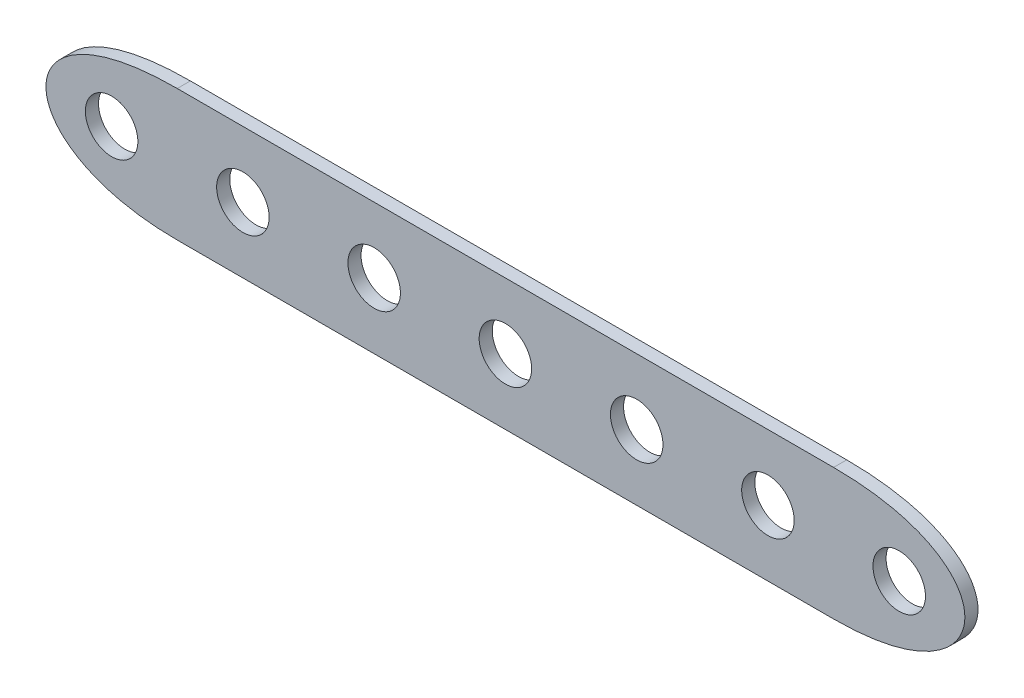
ISO-10303-21;
HEADER;
FILE_DESCRIPTION(('STEP AP214'),'2;1');
FILE_NAME('part.step','',(''),(''),'','','');
FILE_SCHEMA(('AUTOMOTIVE_DESIGN { 1 0 10303 214 1 1 1 1 }'));
ENDSEC;
DATA;
#1=APPLICATION_CONTEXT('core data for automotive mechanical design processes');
#2=APPLICATION_PROTOCOL_DEFINITION('international standard','automotive_design',2000,#1);
#3=PRODUCT_CONTEXT('',#1,'mechanical');
#4=PRODUCT('Part','Part','',(#3));
#5=PRODUCT_RELATED_PRODUCT_CATEGORY('part','',(#4));
#6=PRODUCT_DEFINITION_FORMATION('','',#4);
#7=PRODUCT_DEFINITION_CONTEXT('part definition',#1,'design');
#8=PRODUCT_DEFINITION('design','',#6,#7);
#9=PRODUCT_DEFINITION_SHAPE('','',#8);
#10=(LENGTH_UNIT() NAMED_UNIT(*) SI_UNIT(.MILLI.,.METRE.));
#11=(NAMED_UNIT(*) PLANE_ANGLE_UNIT() SI_UNIT($,.RADIAN.));
#12=(NAMED_UNIT(*) SI_UNIT($,.STERADIAN.) SOLID_ANGLE_UNIT());
#13=UNCERTAINTY_MEASURE_WITH_UNIT(LENGTH_MEASURE(1.E-05),#10,'distance_accuracy_value','');
#14=(GEOMETRIC_REPRESENTATION_CONTEXT(3) GLOBAL_UNCERTAINTY_ASSIGNED_CONTEXT((#13)) GLOBAL_UNIT_ASSIGNED_CONTEXT((#10,
#11,#12)) REPRESENTATION_CONTEXT('',''));
#15=CARTESIAN_POINT('',(0.,0.,0.));
#16=DIRECTION('',(0.,0.,1.));
#17=DIRECTION('',(1.,0.,0.));
#18=AXIS2_PLACEMENT_3D('',#15,#16,#17);
#19=CARTESIAN_POINT('',(0.,-5.,1.));
#20=DIRECTION('',(0.,0.,-1.));
#21=DIRECTION('',(-1.,0.,0.));
#22=AXIS2_PLACEMENT_3D('',#19,#20,#21);
#23=PLANE('',#22);
#24=CARTESIAN_POINT('',(10.,0.,1.));
#25=CARTESIAN_POINT('',(-3.74368541872553,0.,1.));
#26=CARTESIAN_POINT('',(-2.92298124794113,-10.0000000000001,1.));
#27=CARTESIAN_POINT('',(10.,-10.,1.));
#28=B_SPLINE_CURVE_WITH_KNOTS('',3,(#24,#25,#26,#27),.UNSPECIFIED.,.F.,.F.,(4,4),(0.,1.),.UNSPECIFIED.);
#29=CARTESIAN_POINT('',(10.,0.,1.));
#30=VERTEX_POINT('',#29);
#31=CARTESIAN_POINT('',(10.,-10.,1.));
#32=VERTEX_POINT('',#31);
#33=EDGE_CURVE('E88',#30,#32,#28,.T.);
#34=ORIENTED_EDGE('',*,*,#33,.T.);
#35=DIRECTION('',(1.,0.,0.));
#36=VECTOR('',#35,1.);
#37=CARTESIAN_POINT('',(60.,-10.,1.));
#38=LINE('',#37,#36);
#39=CARTESIAN_POINT('',(60.,-10.,1.));
#40=VERTEX_POINT('',#39);
#41=EDGE_CURVE('E83',#32,#40,#38,.T.);
#42=ORIENTED_EDGE('',*,*,#41,.T.);
#43=CARTESIAN_POINT('',(60.,-10.,1.));
#44=CARTESIAN_POINT('',(72.9229812479412,-10.,1.));
#45=CARTESIAN_POINT('',(73.7436854187255,0.,1.));
#46=CARTESIAN_POINT('',(60.,0.,1.));
#47=B_SPLINE_CURVE_WITH_KNOTS('',3,(#43,#44,#45,#46),.UNSPECIFIED.,.F.,.F.,(4,4),(0.,1.),.UNSPECIFIED.);
#48=CARTESIAN_POINT('',(60.,0.,1.));
#49=VERTEX_POINT('',#48);
#50=EDGE_CURVE('E86',#40,#49,#47,.T.);
#51=ORIENTED_EDGE('',*,*,#50,.T.);
#52=DIRECTION('',(-1.,0.,0.));
#53=VECTOR('',#52,1.);
#54=CARTESIAN_POINT('',(10.,0.,1.));
#55=LINE('',#54,#53);
#56=EDGE_CURVE('E53',#49,#30,#55,.T.);
#57=ORIENTED_EDGE('',*,*,#56,.T.);
#58=EDGE_LOOP('',(#34,#42,#51,#57));
#59=FACE_BOUND('',#58,.T.);
#60=CARTESIAN_POINT('',(5.,-5.,1.));
#61=DIRECTION('',(0.,0.,1.));
#62=DIRECTION('',(1.,0.,0.));
#63=AXIS2_PLACEMENT_3D('',#60,#61,#62);
#64=CIRCLE('',#63,2.);
#65=CARTESIAN_POINT('',(7.,-5.,1.));
#66=VERTEX_POINT('',#65);
#67=EDGE_CURVE('E194',#66,#66,#64,.T.);
#68=ORIENTED_EDGE('',*,*,#67,.F.);
#69=EDGE_LOOP('',(#68));
#70=FACE_BOUND('',#69,.T.);
#71=CARTESIAN_POINT('',(65.,-5.,1.));
#72=DIRECTION('',(0.,0.,1.));
#73=DIRECTION('',(1.,0.,0.));
#74=AXIS2_PLACEMENT_3D('',#71,#72,#73);
#75=CIRCLE('',#74,2.);
#76=CARTESIAN_POINT('',(67.,-5.,1.));
#77=VERTEX_POINT('',#76);
#78=EDGE_CURVE('E188',#77,#77,#75,.T.);
#79=ORIENTED_EDGE('',*,*,#78,.F.);
#80=EDGE_LOOP('',(#79));
#81=FACE_BOUND('',#80,.T.);
#82=CARTESIAN_POINT('',(15.,-5.,1.));
#83=DIRECTION('',(0.,0.,1.));
#84=DIRECTION('',(1.,0.,0.));
#85=AXIS2_PLACEMENT_3D('',#82,#83,#84);
#86=CIRCLE('',#85,2.);
#87=CARTESIAN_POINT('',(17.,-5.,1.));
#88=VERTEX_POINT('',#87);
#89=EDGE_CURVE('E182',#88,#88,#86,.T.);
#90=ORIENTED_EDGE('',*,*,#89,.F.);
#91=EDGE_LOOP('',(#90));
#92=FACE_BOUND('',#91,.T.);
#93=CARTESIAN_POINT('',(25.,-5.,1.));
#94=DIRECTION('',(0.,0.,1.));
#95=DIRECTION('',(1.,0.,0.));
#96=AXIS2_PLACEMENT_3D('',#93,#94,#95);
#97=CIRCLE('',#96,2.);
#98=CARTESIAN_POINT('',(27.,-5.,1.));
#99=VERTEX_POINT('',#98);
#100=EDGE_CURVE('E176',#99,#99,#97,.T.);
#101=ORIENTED_EDGE('',*,*,#100,.F.);
#102=EDGE_LOOP('',(#101));
#103=FACE_BOUND('',#102,.T.);
#104=CARTESIAN_POINT('',(35.,-5.,1.));
#105=DIRECTION('',(0.,0.,1.));
#106=DIRECTION('',(1.,0.,0.));
#107=AXIS2_PLACEMENT_3D('',#104,#105,#106);
#108=CIRCLE('',#107,2.);
#109=CARTESIAN_POINT('',(37.,-5.,1.));
#110=VERTEX_POINT('',#109);
#111=EDGE_CURVE('E170',#110,#110,#108,.T.);
#112=ORIENTED_EDGE('',*,*,#111,.F.);
#113=EDGE_LOOP('',(#112));
#114=FACE_BOUND('',#113,.T.);
#115=CARTESIAN_POINT('',(45.,-5.,1.));
#116=DIRECTION('',(0.,0.,1.));
#117=DIRECTION('',(1.,0.,0.));
#118=AXIS2_PLACEMENT_3D('',#115,#116,#117);
#119=CIRCLE('',#118,2.);
#120=CARTESIAN_POINT('',(47.,-5.,1.));
#121=VERTEX_POINT('',#120);
#122=EDGE_CURVE('E164',#121,#121,#119,.T.);
#123=ORIENTED_EDGE('',*,*,#122,.F.);
#124=EDGE_LOOP('',(#123));
#125=FACE_BOUND('',#124,.T.);
#126=CARTESIAN_POINT('',(55.,-5.,1.));
#127=DIRECTION('',(0.,0.,1.));
#128=DIRECTION('',(1.,0.,0.));
#129=AXIS2_PLACEMENT_3D('',#126,#127,#128);
#130=CIRCLE('',#129,2.);
#131=CARTESIAN_POINT('',(57.,-5.,1.));
#132=VERTEX_POINT('',#131);
#133=EDGE_CURVE('E155',#132,#132,#130,.T.);
#134=ORIENTED_EDGE('',*,*,#133,.F.);
#135=EDGE_LOOP('',(#134));
#136=FACE_BOUND('',#135,.T.);
#137=ADVANCED_FACE('F35',(#59,#70,#81,#92,#103,#114,#125,#136),#23,.F.);
#138=CARTESIAN_POINT('',(0.,-5.,0.));
#139=DIRECTION('',(0.,0.,-1.));
#140=DIRECTION('',(-1.,0.,0.));
#141=AXIS2_PLACEMENT_3D('',#138,#139,#140);
#142=PLANE('',#141);
#143=CARTESIAN_POINT('',(45.,-5.,0.));
#144=DIRECTION('',(0.,0.,1.));
#145=DIRECTION('',(1.,0.,0.));
#146=AXIS2_PLACEMENT_3D('',#143,#144,#145);
#147=CIRCLE('',#146,2.);
#148=CARTESIAN_POINT('',(47.,-5.,0.));
#149=VERTEX_POINT('',#148);
#150=EDGE_CURVE('E161',#149,#149,#147,.T.);
#151=ORIENTED_EDGE('',*,*,#150,.T.);
#152=EDGE_LOOP('',(#151));
#153=FACE_BOUND('',#152,.T.);
#154=CARTESIAN_POINT('',(25.,-5.,0.));
#155=DIRECTION('',(0.,0.,1.));
#156=DIRECTION('',(1.,0.,0.));
#157=AXIS2_PLACEMENT_3D('',#154,#155,#156);
#158=CIRCLE('',#157,2.);
#159=CARTESIAN_POINT('',(27.,-5.,0.));
#160=VERTEX_POINT('',#159);
#161=EDGE_CURVE('E173',#160,#160,#158,.T.);
#162=ORIENTED_EDGE('',*,*,#161,.T.);
#163=EDGE_LOOP('',(#162));
#164=FACE_BOUND('',#163,.T.);
#165=CARTESIAN_POINT('',(65.,-5.,0.));
#166=DIRECTION('',(0.,0.,1.));
#167=DIRECTION('',(1.,0.,0.));
#168=AXIS2_PLACEMENT_3D('',#165,#166,#167);
#169=CIRCLE('',#168,2.);
#170=CARTESIAN_POINT('',(67.,-5.,0.));
#171=VERTEX_POINT('',#170);
#172=EDGE_CURVE('E185',#171,#171,#169,.T.);
#173=ORIENTED_EDGE('',*,*,#172,.T.);
#174=EDGE_LOOP('',(#173));
#175=FACE_BOUND('',#174,.T.);
#176=CARTESIAN_POINT('',(10.,0.,0.));
#177=CARTESIAN_POINT('',(-3.74368541872553,0.,0.));
#178=CARTESIAN_POINT('',(-2.92298124794113,-10.0000000000001,0.));
#179=CARTESIAN_POINT('',(10.,-10.,0.));
#180=B_SPLINE_CURVE_WITH_KNOTS('',3,(#176,#177,#178,#179),.UNSPECIFIED.,.F.,.F.,(4,4),(0.,1.),.UNSPECIFIED.);
#181=CARTESIAN_POINT('',(10.,0.,0.));
#182=VERTEX_POINT('',#181);
#183=CARTESIAN_POINT('',(10.,-10.,0.));
#184=VERTEX_POINT('',#183);
#185=EDGE_CURVE('E197',#182,#184,#180,.T.);
#186=ORIENTED_EDGE('',*,*,#185,.F.);
#187=DIRECTION('',(-1.,0.,0.));
#188=VECTOR('',#187,1.);
#189=CARTESIAN_POINT('',(10.,0.,0.));
#190=LINE('',#189,#188);
#191=CARTESIAN_POINT('',(60.,0.,0.));
#192=VERTEX_POINT('',#191);
#193=EDGE_CURVE('E76',#192,#182,#190,.T.);
#194=ORIENTED_EDGE('',*,*,#193,.F.);
#195=CARTESIAN_POINT('',(60.,-10.,0.));
#196=CARTESIAN_POINT('',(72.9229812479412,-10.,0.));
#197=CARTESIAN_POINT('',(73.7436854187255,0.,0.));
#198=CARTESIAN_POINT('',(60.,0.,0.));
#199=B_SPLINE_CURVE_WITH_KNOTS('',3,(#195,#196,#197,#198),.UNSPECIFIED.,.F.,.F.,(4,4),(0.,1.),.UNSPECIFIED.);
#200=CARTESIAN_POINT('',(60.,-10.,0.));
#201=VERTEX_POINT('',#200);
#202=EDGE_CURVE('E70',#201,#192,#199,.T.);
#203=ORIENTED_EDGE('',*,*,#202,.F.);
#204=DIRECTION('',(1.,0.,0.));
#205=VECTOR('',#204,1.);
#206=CARTESIAN_POINT('',(60.,-10.,0.));
#207=LINE('',#206,#205);
#208=EDGE_CURVE('E92',#184,#201,#207,.T.);
#209=ORIENTED_EDGE('',*,*,#208,.F.);
#210=EDGE_LOOP('',(#186,#194,#203,#209));
#211=FACE_BOUND('',#210,.T.);
#212=CARTESIAN_POINT('',(5.,-5.,0.));
#213=DIRECTION('',(0.,0.,1.));
#214=DIRECTION('',(1.,0.,0.));
#215=AXIS2_PLACEMENT_3D('',#212,#213,#214);
#216=CIRCLE('',#215,2.);
#217=CARTESIAN_POINT('',(7.,-5.,0.));
#218=VERTEX_POINT('',#217);
#219=EDGE_CURVE('E191',#218,#218,#216,.T.);
#220=ORIENTED_EDGE('',*,*,#219,.T.);
#221=EDGE_LOOP('',(#220));
#222=FACE_BOUND('',#221,.T.);
#223=CARTESIAN_POINT('',(15.,-5.,0.));
#224=DIRECTION('',(0.,0.,1.));
#225=DIRECTION('',(1.,0.,0.));
#226=AXIS2_PLACEMENT_3D('',#223,#224,#225);
#227=CIRCLE('',#226,2.);
#228=CARTESIAN_POINT('',(17.,-5.,0.));
#229=VERTEX_POINT('',#228);
#230=EDGE_CURVE('E179',#229,#229,#227,.T.);
#231=ORIENTED_EDGE('',*,*,#230,.T.);
#232=EDGE_LOOP('',(#231));
#233=FACE_BOUND('',#232,.T.);
#234=CARTESIAN_POINT('',(35.,-5.,0.));
#235=DIRECTION('',(0.,0.,1.));
#236=DIRECTION('',(1.,0.,0.));
#237=AXIS2_PLACEMENT_3D('',#234,#235,#236);
#238=CIRCLE('',#237,2.);
#239=CARTESIAN_POINT('',(37.,-5.,0.));
#240=VERTEX_POINT('',#239);
#241=EDGE_CURVE('E167',#240,#240,#238,.T.);
#242=ORIENTED_EDGE('',*,*,#241,.T.);
#243=EDGE_LOOP('',(#242));
#244=FACE_BOUND('',#243,.T.);
#245=CARTESIAN_POINT('',(55.,-5.,0.));
#246=DIRECTION('',(0.,0.,1.));
#247=DIRECTION('',(1.,0.,0.));
#248=AXIS2_PLACEMENT_3D('',#245,#246,#247);
#249=CIRCLE('',#248,2.);
#250=CARTESIAN_POINT('',(57.,-5.,0.));
#251=VERTEX_POINT('',#250);
#252=EDGE_CURVE('E158',#251,#251,#249,.T.);
#253=ORIENTED_EDGE('',*,*,#252,.T.);
#254=EDGE_LOOP('',(#253));
#255=FACE_BOUND('',#254,.T.);
#256=ADVANCED_FACE('F114',(#153,#164,#175,#211,#222,#233,#244,#255),#142,.T.);
#257=DIRECTION('',(0.,0.,-1.));
#258=VECTOR('',#257,1.);
#259=SURFACE_OF_LINEAR_EXTRUSION('',#28,#258);
#260=ORIENTED_EDGE('',*,*,#185,.T.);
#261=DIRECTION('',(0.,0.,-1.));
#262=VECTOR('',#261,1.);
#263=CARTESIAN_POINT('',(10.,-10.,1.));
#264=LINE('',#263,#262);
#265=EDGE_CURVE('E11',#32,#184,#264,.T.);
#266=ORIENTED_EDGE('',*,*,#265,.F.);
#267=ORIENTED_EDGE('',*,*,#33,.F.);
#268=DIRECTION('',(0.,0.,-1.));
#269=VECTOR('',#268,1.);
#270=CARTESIAN_POINT('',(10.,0.,1.));
#271=LINE('',#270,#269);
#272=EDGE_CURVE('E96',#30,#182,#271,.T.);
#273=ORIENTED_EDGE('',*,*,#272,.T.);
#274=EDGE_LOOP('',(#260,#266,#267,#273));
#275=FACE_BOUND('',#274,.T.);
#276=ADVANCED_FACE('F37',(#275),#259,.F.);
#277=CARTESIAN_POINT('',(60.,-10.,1.));
#278=DIRECTION('',(0.,1.,0.));
#279=DIRECTION('',(0.,0.,1.));
#280=AXIS2_PLACEMENT_3D('',#277,#278,#279);
#281=PLANE('',#280);
#282=ORIENTED_EDGE('',*,*,#208,.T.);
#283=DIRECTION('',(0.,0.,-1.));
#284=VECTOR('',#283,1.);
#285=CARTESIAN_POINT('',(60.,-10.,1.));
#286=LINE('',#285,#284);
#287=EDGE_CURVE('E45',#40,#201,#286,.T.);
#288=ORIENTED_EDGE('',*,*,#287,.F.);
#289=ORIENTED_EDGE('',*,*,#41,.F.);
#290=ORIENTED_EDGE('',*,*,#265,.T.);
#291=EDGE_LOOP('',(#282,#288,#289,#290));
#292=FACE_BOUND('',#291,.T.);
#293=ADVANCED_FACE('F91',(#292),#281,.F.);
#294=DIRECTION('',(0.,0.,-1.));
#295=VECTOR('',#294,1.);
#296=SURFACE_OF_LINEAR_EXTRUSION('',#47,#295);
#297=ORIENTED_EDGE('',*,*,#202,.T.);
#298=DIRECTION('',(0.,0.,-1.));
#299=VECTOR('',#298,1.);
#300=CARTESIAN_POINT('',(60.,0.,1.));
#301=LINE('',#300,#299);
#302=EDGE_CURVE('E93',#49,#192,#301,.T.);
#303=ORIENTED_EDGE('',*,*,#302,.F.);
#304=ORIENTED_EDGE('',*,*,#50,.F.);
#305=ORIENTED_EDGE('',*,*,#287,.T.);
#306=EDGE_LOOP('',(#297,#303,#304,#305));
#307=FACE_BOUND('',#306,.T.);
#308=ADVANCED_FACE('F94',(#307),#296,.F.);
#309=CARTESIAN_POINT('',(10.,0.,1.));
#310=DIRECTION('',(0.,-1.,0.));
#311=DIRECTION('',(0.,0.,-1.));
#312=AXIS2_PLACEMENT_3D('',#309,#310,#311);
#313=PLANE('',#312);
#314=ORIENTED_EDGE('',*,*,#193,.T.);
#315=ORIENTED_EDGE('',*,*,#272,.F.);
#316=ORIENTED_EDGE('',*,*,#56,.F.);
#317=ORIENTED_EDGE('',*,*,#302,.T.);
#318=EDGE_LOOP('',(#314,#315,#316,#317));
#319=FACE_BOUND('',#318,.T.);
#320=ADVANCED_FACE('F108',(#319),#313,.F.);
#321=CARTESIAN_POINT('',(5.,-5.,1.));
#322=DIRECTION('',(0.,0.,-1.));
#323=DIRECTION('',(-1.,0.,0.));
#324=AXIS2_PLACEMENT_3D('',#321,#322,#323);
#325=CYLINDRICAL_SURFACE('',#324,2.);
#326=ORIENTED_EDGE('',*,*,#67,.T.);
#327=EDGE_LOOP('',(#326));
#328=FACE_BOUND('',#327,.T.);
#329=ORIENTED_EDGE('',*,*,#219,.F.);
#330=EDGE_LOOP('',(#329));
#331=FACE_BOUND('',#330,.T.);
#332=ADVANCED_FACE('F123',(#328,#331),#325,.F.);
#333=CARTESIAN_POINT('',(65.,-5.,1.));
#334=DIRECTION('',(0.,0.,-1.));
#335=DIRECTION('',(-1.,0.,0.));
#336=AXIS2_PLACEMENT_3D('',#333,#334,#335);
#337=CYLINDRICAL_SURFACE('',#336,2.);
#338=ORIENTED_EDGE('',*,*,#78,.T.);
#339=EDGE_LOOP('',(#338));
#340=FACE_BOUND('',#339,.T.);
#341=ORIENTED_EDGE('',*,*,#172,.F.);
#342=EDGE_LOOP('',(#341));
#343=FACE_BOUND('',#342,.T.);
#344=ADVANCED_FACE('F126',(#340,#343),#337,.F.);
#345=CARTESIAN_POINT('',(15.,-5.,1.));
#346=DIRECTION('',(0.,0.,-1.));
#347=DIRECTION('',(-1.,0.,0.));
#348=AXIS2_PLACEMENT_3D('',#345,#346,#347);
#349=CYLINDRICAL_SURFACE('',#348,2.);
#350=ORIENTED_EDGE('',*,*,#89,.T.);
#351=EDGE_LOOP('',(#350));
#352=FACE_BOUND('',#351,.T.);
#353=ORIENTED_EDGE('',*,*,#230,.F.);
#354=EDGE_LOOP('',(#353));
#355=FACE_BOUND('',#354,.T.);
#356=ADVANCED_FACE('F130',(#352,#355),#349,.F.);
#357=CARTESIAN_POINT('',(25.,-5.,1.));
#358=DIRECTION('',(0.,0.,-1.));
#359=DIRECTION('',(-1.,0.,0.));
#360=AXIS2_PLACEMENT_3D('',#357,#358,#359);
#361=CYLINDRICAL_SURFACE('',#360,2.);
#362=ORIENTED_EDGE('',*,*,#100,.T.);
#363=EDGE_LOOP('',(#362));
#364=FACE_BOUND('',#363,.T.);
#365=ORIENTED_EDGE('',*,*,#161,.F.);
#366=EDGE_LOOP('',(#365));
#367=FACE_BOUND('',#366,.T.);
#368=ADVANCED_FACE('F134',(#364,#367),#361,.F.);
#369=CARTESIAN_POINT('',(35.,-5.,1.));
#370=DIRECTION('',(0.,0.,-1.));
#371=DIRECTION('',(-1.,0.,0.));
#372=AXIS2_PLACEMENT_3D('',#369,#370,#371);
#373=CYLINDRICAL_SURFACE('',#372,2.);
#374=ORIENTED_EDGE('',*,*,#111,.T.);
#375=EDGE_LOOP('',(#374));
#376=FACE_BOUND('',#375,.T.);
#377=ORIENTED_EDGE('',*,*,#241,.F.);
#378=EDGE_LOOP('',(#377));
#379=FACE_BOUND('',#378,.T.);
#380=ADVANCED_FACE('F138',(#376,#379),#373,.F.);
#381=CARTESIAN_POINT('',(45.,-5.,1.));
#382=DIRECTION('',(0.,0.,-1.));
#383=DIRECTION('',(-1.,0.,0.));
#384=AXIS2_PLACEMENT_3D('',#381,#382,#383);
#385=CYLINDRICAL_SURFACE('',#384,2.);
#386=ORIENTED_EDGE('',*,*,#122,.T.);
#387=EDGE_LOOP('',(#386));
#388=FACE_BOUND('',#387,.T.);
#389=ORIENTED_EDGE('',*,*,#150,.F.);
#390=EDGE_LOOP('',(#389));
#391=FACE_BOUND('',#390,.T.);
#392=ADVANCED_FACE('F142',(#388,#391),#385,.F.);
#393=CARTESIAN_POINT('',(55.,-5.,1.));
#394=DIRECTION('',(0.,0.,-1.));
#395=DIRECTION('',(-1.,0.,0.));
#396=AXIS2_PLACEMENT_3D('',#393,#394,#395);
#397=CYLINDRICAL_SURFACE('',#396,2.);
#398=ORIENTED_EDGE('',*,*,#133,.T.);
#399=EDGE_LOOP('',(#398));
#400=FACE_BOUND('',#399,.T.);
#401=ORIENTED_EDGE('',*,*,#252,.F.);
#402=EDGE_LOOP('',(#401));
#403=FACE_BOUND('',#402,.T.);
#404=ADVANCED_FACE('F146',(#400,#403),#397,.F.);
#405=CLOSED_SHELL('',(#137,#256,#276,#293,#308,#320,#332,#344,#356,#368,#380,#392,#404));
#406=MANIFOLD_SOLID_BREP('B2',#405);
#407=ADVANCED_BREP_SHAPE_REPRESENTATION('',(#18,#406),#14);
#408=SHAPE_DEFINITION_REPRESENTATION(#9,#407);
ENDSEC;
END-ISO-10303-21;
